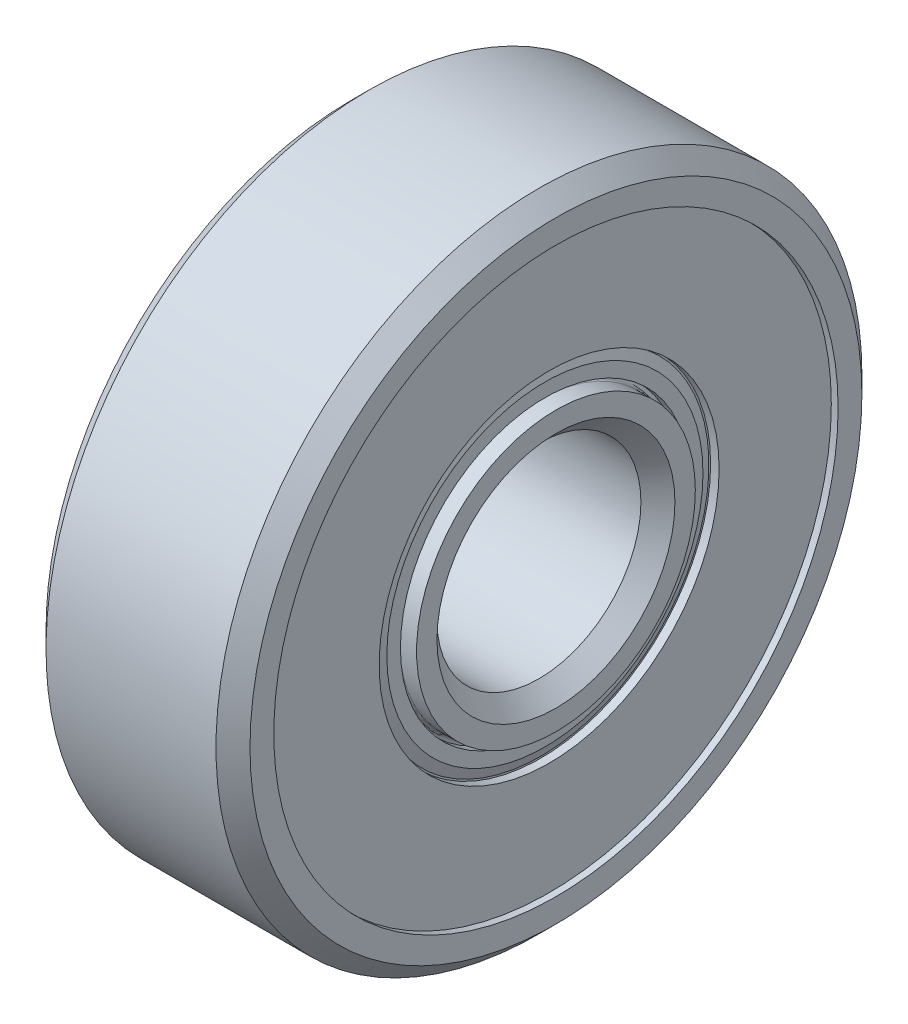
ISO-10303-21;
HEADER;
FILE_DESCRIPTION(('STEP AP214'),'2;1');
FILE_NAME('part.step','',(''),(''),'','','');
FILE_SCHEMA(('AUTOMOTIVE_DESIGN { 1 0 10303 214 1 1 1 1 }'));
ENDSEC;
DATA;
#1=APPLICATION_CONTEXT('core data for automotive mechanical design processes');
#2=APPLICATION_PROTOCOL_DEFINITION('international standard','automotive_design',2000,#1);
#3=PRODUCT_CONTEXT('',#1,'mechanical');
#4=PRODUCT('Part','Part','',(#3));
#5=PRODUCT_RELATED_PRODUCT_CATEGORY('part','',(#4));
#6=PRODUCT_DEFINITION_FORMATION('','',#4);
#7=PRODUCT_DEFINITION_CONTEXT('part definition',#1,'design');
#8=PRODUCT_DEFINITION('design','',#6,#7);
#9=PRODUCT_DEFINITION_SHAPE('','',#8);
#10=(LENGTH_UNIT() NAMED_UNIT(*) SI_UNIT(.MILLI.,.METRE.));
#11=(NAMED_UNIT(*) PLANE_ANGLE_UNIT() SI_UNIT($,.RADIAN.));
#12=(NAMED_UNIT(*) SI_UNIT($,.STERADIAN.) SOLID_ANGLE_UNIT());
#13=UNCERTAINTY_MEASURE_WITH_UNIT(LENGTH_MEASURE(1.E-05),#10,'distance_accuracy_value','');
#14=(GEOMETRIC_REPRESENTATION_CONTEXT(3) GLOBAL_UNCERTAINTY_ASSIGNED_CONTEXT((#13)) GLOBAL_UNIT_ASSIGNED_CONTEXT((#10,
#11,#12)) REPRESENTATION_CONTEXT('',''));
#15=CARTESIAN_POINT('',(0.,0.,0.));
#16=DIRECTION('',(0.,0.,1.));
#17=DIRECTION('',(1.,0.,0.));
#18=AXIS2_PLACEMENT_3D('',#15,#16,#17);
#19=CARTESIAN_POINT('',(0.,0.,0.));
#20=DIRECTION('',(1.,0.,0.));
#21=DIRECTION('',(0.,0.,-1.));
#22=AXIS2_PLACEMENT_3D('',#19,#20,#21);
#23=CYLINDRICAL_SURFACE('',#22,8.3);
#24=CARTESIAN_POINT('',(2.8,0.,0.));
#25=DIRECTION('',(1.,0.,0.));
#26=DIRECTION('',(0.,0.,-1.));
#27=AXIS2_PLACEMENT_3D('',#24,#25,#26);
#28=CIRCLE('',#27,8.3);
#29=CARTESIAN_POINT('',(2.8,0.,-8.3));
#30=VERTEX_POINT('',#29);
#31=EDGE_CURVE('P0_E10',#30,#30,#28,.T.);
#32=ORIENTED_EDGE('',*,*,#31,.F.);
#33=EDGE_LOOP('',(#32));
#34=FACE_BOUND('',#33,.T.);
#35=CARTESIAN_POINT('',(2.99999999999998,0.,0.));
#36=DIRECTION('',(1.,0.,0.));
#37=DIRECTION('',(0.,0.,-1.));
#38=AXIS2_PLACEMENT_3D('',#35,#36,#37);
#39=CIRCLE('',#38,8.3);
#40=CARTESIAN_POINT('',(2.99999999999998,0.,-8.3));
#41=VERTEX_POINT('',#40);
#42=EDGE_CURVE('P0_E38',#41,#41,#39,.T.);
#43=ORIENTED_EDGE('',*,*,#42,.T.);
#44=EDGE_LOOP('',(#43));
#45=FACE_BOUND('',#44,.T.);
#46=ADVANCED_FACE('P0_F15',(#34,#45),#23,.F.);
#47=CARTESIAN_POINT('',(0.,0.,0.));
#48=DIRECTION('',(1.,0.,0.));
#49=DIRECTION('',(0.,0.,-1.));
#50=AXIS2_PLACEMENT_3D('',#47,#48,#49);
#51=CYLINDRICAL_SURFACE('',#50,8.5);
#52=CARTESIAN_POINT('',(2.3,0.,0.));
#53=DIRECTION('',(1.,0.,0.));
#54=DIRECTION('',(0.,0.,-1.));
#55=AXIS2_PLACEMENT_3D('',#52,#53,#54);
#56=CIRCLE('',#55,8.5);
#57=CARTESIAN_POINT('',(2.3,0.,-8.5));
#58=VERTEX_POINT('',#57);
#59=EDGE_CURVE('P0_E24',#58,#58,#56,.T.);
#60=ORIENTED_EDGE('',*,*,#59,.F.);
#61=EDGE_LOOP('',(#60));
#62=FACE_BOUND('',#61,.T.);
#63=CARTESIAN_POINT('',(2.8,0.,0.));
#64=DIRECTION('',(1.,0.,0.));
#65=DIRECTION('',(0.,0.,-1.));
#66=AXIS2_PLACEMENT_3D('',#63,#64,#65);
#67=CIRCLE('',#66,8.5);
#68=CARTESIAN_POINT('',(2.8,0.,-8.5));
#69=VERTEX_POINT('',#68);
#70=EDGE_CURVE('P0_E39',#69,#69,#67,.T.);
#71=ORIENTED_EDGE('',*,*,#70,.T.);
#72=EDGE_LOOP('',(#71));
#73=FACE_BOUND('',#72,.T.);
#74=ADVANCED_FACE('P0_F111',(#62,#73),#51,.F.);
#75=CARTESIAN_POINT('',(0.,0.,0.));
#76=DIRECTION('',(1.,0.,0.));
#77=DIRECTION('',(0.,0.,-1.));
#78=AXIS2_PLACEMENT_3D('',#75,#76,#77);
#79=CYLINDRICAL_SURFACE('',#78,8.);
#80=CARTESIAN_POINT('',(1.3228756555323,0.,0.));
#81=DIRECTION('',(1.,0.,0.));
#82=DIRECTION('',(0.,0.,-1.));
#83=AXIS2_PLACEMENT_3D('',#80,#81,#82);
#84=CIRCLE('',#83,8.);
#85=CARTESIAN_POINT('',(1.3228756555323,0.,-8.));
#86=VERTEX_POINT('',#85);
#87=EDGE_CURVE('P0_E34',#86,#86,#84,.T.);
#88=ORIENTED_EDGE('',*,*,#87,.F.);
#89=EDGE_LOOP('',(#88));
#90=FACE_BOUND('',#89,.T.);
#91=CARTESIAN_POINT('',(2.3,0.,0.));
#92=DIRECTION('',(1.,0.,0.));
#93=DIRECTION('',(0.,0.,-1.));
#94=AXIS2_PLACEMENT_3D('',#91,#92,#93);
#95=CIRCLE('',#94,8.);
#96=CARTESIAN_POINT('',(2.3,0.,-8.));
#97=VERTEX_POINT('',#96);
#98=EDGE_CURVE('P0_E42',#97,#97,#95,.T.);
#99=ORIENTED_EDGE('',*,*,#98,.T.);
#100=EDGE_LOOP('',(#99));
#101=FACE_BOUND('',#100,.T.);
#102=ADVANCED_FACE('P0_F117',(#90,#101),#79,.F.);
#103=CARTESIAN_POINT('',(0.,0.,0.));
#104=DIRECTION('',(1.,0.,0.));
#105=DIRECTION('',(0.,-0.479425538604203,0.877582561890373));
#106=AXIS2_PLACEMENT_3D('',#103,#104,#105);
#107=TOROIDAL_SURFACE('',#106,6.5,2.);
#108=CARTESIAN_POINT('',(-1.32287565553229,0.,0.));
#109=DIRECTION('',(1.,0.,0.));
#110=DIRECTION('',(0.,0.,-1.));
#111=AXIS2_PLACEMENT_3D('',#108,#109,#110);
#112=CIRCLE('',#111,8.);
#113=CARTESIAN_POINT('',(-1.32287565553229,0.,-8.));
#114=VERTEX_POINT('',#113);
#115=EDGE_CURVE('P0_E51',#114,#114,#112,.T.);
#116=ORIENTED_EDGE('',*,*,#115,.F.);
#117=EDGE_LOOP('',(#116));
#118=FACE_BOUND('',#117,.T.);
#119=ORIENTED_EDGE('',*,*,#87,.T.);
#120=EDGE_LOOP('',(#119));
#121=FACE_BOUND('',#120,.T.);
#122=ADVANCED_FACE('P0_F123',(#118,#121),#107,.F.);
#123=CARTESIAN_POINT('',(0.,0.,0.));
#124=DIRECTION('',(1.,0.,0.));
#125=DIRECTION('',(0.,0.,-1.));
#126=AXIS2_PLACEMENT_3D('',#123,#124,#125);
#127=CYLINDRICAL_SURFACE('',#126,8.);
#128=CARTESIAN_POINT('',(-2.3,0.,0.));
#129=DIRECTION('',(1.,0.,0.));
#130=DIRECTION('',(0.,0.,-1.));
#131=AXIS2_PLACEMENT_3D('',#128,#129,#130);
#132=CIRCLE('',#131,8.);
#133=CARTESIAN_POINT('',(-2.3,0.,-8.));
#134=VERTEX_POINT('',#133);
#135=EDGE_CURVE('P0_E55',#134,#134,#132,.T.);
#136=ORIENTED_EDGE('',*,*,#135,.F.);
#137=EDGE_LOOP('',(#136));
#138=FACE_BOUND('',#137,.T.);
#139=ORIENTED_EDGE('',*,*,#115,.T.);
#140=EDGE_LOOP('',(#139));
#141=FACE_BOUND('',#140,.T.);
#142=ADVANCED_FACE('P0_F127',(#138,#141),#127,.F.);
#143=CARTESIAN_POINT('',(0.,0.,0.));
#144=DIRECTION('',(1.,0.,0.));
#145=DIRECTION('',(0.,0.,-1.));
#146=AXIS2_PLACEMENT_3D('',#143,#144,#145);
#147=CYLINDRICAL_SURFACE('',#146,8.5);
#148=CARTESIAN_POINT('',(-2.8,0.,0.));
#149=DIRECTION('',(1.,0.,0.));
#150=DIRECTION('',(0.,0.,-1.));
#151=AXIS2_PLACEMENT_3D('',#148,#149,#150);
#152=CIRCLE('',#151,8.5);
#153=CARTESIAN_POINT('',(-2.8,0.,-8.5));
#154=VERTEX_POINT('',#153);
#155=EDGE_CURVE('P0_E59',#154,#154,#152,.T.);
#156=ORIENTED_EDGE('',*,*,#155,.F.);
#157=EDGE_LOOP('',(#156));
#158=FACE_BOUND('',#157,.T.);
#159=CARTESIAN_POINT('',(-2.3,0.,0.));
#160=DIRECTION('',(1.,0.,0.));
#161=DIRECTION('',(0.,0.,-1.));
#162=AXIS2_PLACEMENT_3D('',#159,#160,#161);
#163=CIRCLE('',#162,8.5);
#164=CARTESIAN_POINT('',(-2.3,0.,-8.5));
#165=VERTEX_POINT('',#164);
#166=EDGE_CURVE('P0_E47',#165,#165,#163,.T.);
#167=ORIENTED_EDGE('',*,*,#166,.T.);
#168=EDGE_LOOP('',(#167));
#169=FACE_BOUND('',#168,.T.);
#170=ADVANCED_FACE('P0_F131',(#158,#169),#147,.F.);
#171=CARTESIAN_POINT('',(0.,0.,0.));
#172=DIRECTION('',(1.,0.,0.));
#173=DIRECTION('',(0.,0.,-1.));
#174=AXIS2_PLACEMENT_3D('',#171,#172,#173);
#175=CYLINDRICAL_SURFACE('',#174,8.3);
#176=CARTESIAN_POINT('',(-3.00000000000003,0.,0.));
#177=DIRECTION('',(1.,0.,0.));
#178=DIRECTION('',(0.,0.,-1.));
#179=AXIS2_PLACEMENT_3D('',#176,#177,#178);
#180=CIRCLE('',#179,8.3);
#181=CARTESIAN_POINT('',(-3.00000000000003,0.,-8.3));
#182=VERTEX_POINT('',#181);
#183=EDGE_CURVE('P0_E41',#182,#182,#180,.T.);
#184=ORIENTED_EDGE('',*,*,#183,.F.);
#185=EDGE_LOOP('',(#184));
#186=FACE_BOUND('',#185,.T.);
#187=CARTESIAN_POINT('',(-2.8,0.,0.));
#188=DIRECTION('',(1.,0.,0.));
#189=DIRECTION('',(0.,0.,-1.));
#190=AXIS2_PLACEMENT_3D('',#187,#188,#189);
#191=CIRCLE('',#190,8.3);
#192=CARTESIAN_POINT('',(-2.8,0.,-8.3));
#193=VERTEX_POINT('',#192);
#194=EDGE_CURVE('P0_E63',#193,#193,#191,.T.);
#195=ORIENTED_EDGE('',*,*,#194,.T.);
#196=EDGE_LOOP('',(#195));
#197=FACE_BOUND('',#196,.T.);
#198=ADVANCED_FACE('P0_F135',(#186,#197),#175,.F.);
#199=CARTESIAN_POINT('',(2.8,0.,8.3));
#200=DIRECTION('',(1.,0.,0.));
#201=DIRECTION('',(0.,0.,-1.));
#202=AXIS2_PLACEMENT_3D('',#199,#200,#201);
#203=PLANE('',#202);
#204=ORIENTED_EDGE('',*,*,#70,.F.);
#205=EDGE_LOOP('',(#204));
#206=FACE_BOUND('',#205,.T.);
#207=ORIENTED_EDGE('',*,*,#31,.T.);
#208=EDGE_LOOP('',(#207));
#209=FACE_BOUND('',#208,.T.);
#210=ADVANCED_FACE('P0_F139',(#206,#209),#203,.F.);
#211=CARTESIAN_POINT('',(2.30000000000001,0.,8.5));
#212=DIRECTION('',(1.,0.,0.));
#213=DIRECTION('',(0.,0.,-1.));
#214=AXIS2_PLACEMENT_3D('',#211,#212,#213);
#215=PLANE('',#214);
#216=ORIENTED_EDGE('',*,*,#59,.T.);
#217=EDGE_LOOP('',(#216));
#218=FACE_BOUND('',#217,.T.);
#219=ORIENTED_EDGE('',*,*,#98,.F.);
#220=EDGE_LOOP('',(#219));
#221=FACE_BOUND('',#220,.T.);
#222=ADVANCED_FACE('P0_F143',(#218,#221),#215,.T.);
#223=CARTESIAN_POINT('',(-2.3,0.,8.5));
#224=DIRECTION('',(1.,0.,0.));
#225=DIRECTION('',(0.,0.,-1.));
#226=AXIS2_PLACEMENT_3D('',#223,#224,#225);
#227=PLANE('',#226);
#228=ORIENTED_EDGE('',*,*,#166,.F.);
#229=EDGE_LOOP('',(#228));
#230=FACE_BOUND('',#229,.T.);
#231=ORIENTED_EDGE('',*,*,#135,.T.);
#232=EDGE_LOOP('',(#231));
#233=FACE_BOUND('',#232,.T.);
#234=ADVANCED_FACE('P0_F147',(#230,#233),#227,.F.);
#235=CARTESIAN_POINT('',(-2.8,0.,8.3));
#236=DIRECTION('',(1.,0.,0.));
#237=DIRECTION('',(0.,0.,-1.));
#238=AXIS2_PLACEMENT_3D('',#235,#236,#237);
#239=PLANE('',#238);
#240=ORIENTED_EDGE('',*,*,#155,.T.);
#241=EDGE_LOOP('',(#240));
#242=FACE_BOUND('',#241,.T.);
#243=ORIENTED_EDGE('',*,*,#194,.F.);
#244=EDGE_LOOP('',(#243));
#245=FACE_BOUND('',#244,.T.);
#246=ADVANCED_FACE('P0_F151',(#242,#245),#239,.T.);
#247=CARTESIAN_POINT('',(-3.,0.,9.50000095367423));
#248=DIRECTION('',(1.,0.,0.));
#249=DIRECTION('',(0.,0.,-1.));
#250=AXIS2_PLACEMENT_3D('',#247,#248,#249);
#251=PLANE('',#250);
#252=CARTESIAN_POINT('',(-3.,0.,0.));
#253=DIRECTION('',(1.,0.,0.));
#254=DIRECTION('',(0.,0.,-1.));
#255=AXIS2_PLACEMENT_3D('',#252,#253,#254);
#256=CIRCLE('',#255,9.);
#257=CARTESIAN_POINT('',(-3.,0.,-9.00000000000001));
#258=VERTEX_POINT('',#257);
#259=EDGE_CURVE('P0_E70',#258,#258,#256,.T.);
#260=ORIENTED_EDGE('',*,*,#259,.F.);
#261=EDGE_LOOP('',(#260));
#262=FACE_BOUND('',#261,.T.);
#263=ORIENTED_EDGE('',*,*,#183,.T.);
#264=EDGE_LOOP('',(#263));
#265=FACE_BOUND('',#264,.T.);
#266=ADVANCED_FACE('P0_F107',(#262,#265),#251,.F.);
#267=CARTESIAN_POINT('',(-12.,0.,0.));
#268=DIRECTION('',(1.,0.,0.));
#269=DIRECTION('',(0.,1.,0.));
#270=AXIS2_PLACEMENT_3D('',#267,#268,#269);
#271=CONICAL_SURFACE('',#270,0.,0.785398163397451);
#272=ORIENTED_EDGE('',*,*,#259,.T.);
#273=EDGE_LOOP('',(#272));
#274=FACE_BOUND('',#273,.T.);
#275=CARTESIAN_POINT('',(-2.50000000000001,0.,0.));
#276=DIRECTION('',(1.,0.,0.));
#277=DIRECTION('',(0.,1.,0.));
#278=AXIS2_PLACEMENT_3D('',#275,#276,#277);
#279=CIRCLE('',#278,9.5);
#280=CARTESIAN_POINT('',(-2.49999999999998,9.5,0.));
#281=VERTEX_POINT('',#280);
#282=EDGE_CURVE('P0_E77',#281,#281,#279,.T.);
#283=ORIENTED_EDGE('',*,*,#282,.F.);
#284=EDGE_LOOP('',(#283));
#285=FACE_BOUND('',#284,.T.);
#286=ADVANCED_FACE('P0_F99',(#274,#285),#271,.T.);
#287=CARTESIAN_POINT('',(3.,0.,8.3));
#288=DIRECTION('',(1.,0.,0.));
#289=DIRECTION('',(0.,0.,-1.));
#290=AXIS2_PLACEMENT_3D('',#287,#288,#289);
#291=PLANE('',#290);
#292=CARTESIAN_POINT('',(3.,0.,0.));
#293=DIRECTION('',(1.,0.,0.));
#294=DIRECTION('',(0.,0.,-1.));
#295=AXIS2_PLACEMENT_3D('',#292,#293,#294);
#296=CIRCLE('',#295,9.);
#297=CARTESIAN_POINT('',(3.,0.,-9.));
#298=VERTEX_POINT('',#297);
#299=EDGE_CURVE('P0_E80',#298,#298,#296,.T.);
#300=ORIENTED_EDGE('',*,*,#299,.T.);
#301=EDGE_LOOP('',(#300));
#302=FACE_BOUND('',#301,.T.);
#303=ORIENTED_EDGE('',*,*,#42,.F.);
#304=EDGE_LOOP('',(#303));
#305=FACE_BOUND('',#304,.T.);
#306=ADVANCED_FACE('P0_F96',(#302,#305),#291,.T.);
#307=CARTESIAN_POINT('',(0.,0.,0.));
#308=DIRECTION('',(1.,0.,0.));
#309=DIRECTION('',(0.,0.,-1.));
#310=AXIS2_PLACEMENT_3D('',#307,#308,#309);
#311=CYLINDRICAL_SURFACE('',#310,9.5);
#312=CARTESIAN_POINT('',(2.5,0.,0.));
#313=DIRECTION('',(1.,0.,0.));
#314=DIRECTION('',(0.,0.,-1.));
#315=AXIS2_PLACEMENT_3D('',#312,#313,#314);
#316=CIRCLE('',#315,9.5);
#317=CARTESIAN_POINT('',(2.5,0.,-9.5));
#318=VERTEX_POINT('',#317);
#319=EDGE_CURVE('P0_E19',#318,#318,#316,.T.);
#320=ORIENTED_EDGE('',*,*,#319,.F.);
#321=EDGE_LOOP('',(#320));
#322=FACE_BOUND('',#321,.T.);
#323=ORIENTED_EDGE('',*,*,#282,.T.);
#324=EDGE_LOOP('',(#323));
#325=FACE_BOUND('',#324,.T.);
#326=ADVANCED_FACE('P0_F98',(#322,#325),#311,.T.);
#327=CARTESIAN_POINT('',(12.,0.,0.));
#328=DIRECTION('',(-1.,0.,0.));
#329=DIRECTION('',(0.,-1.,0.));
#330=AXIS2_PLACEMENT_3D('',#327,#328,#329);
#331=CONICAL_SURFACE('',#330,0.,0.785398163397447);
#332=ORIENTED_EDGE('',*,*,#319,.T.);
#333=EDGE_LOOP('',(#332));
#334=FACE_BOUND('',#333,.T.);
#335=ORIENTED_EDGE('',*,*,#299,.F.);
#336=EDGE_LOOP('',(#335));
#337=FACE_BOUND('',#336,.T.);
#338=ADVANCED_FACE('P0_F17',(#334,#337),#331,.T.);
#339=CLOSED_SHELL('',(#46,#74,#102,#122,#142,#170,#198,#210,#222,#234,#246,#266,#286,#306,#326,#338));
#340=MANIFOLD_SOLID_BREP('P0_B1',#339);
#341=CARTESIAN_POINT('',(0.,0.,0.));
#342=DIRECTION('',(1.,0.,0.));
#343=DIRECTION('',(0.,0.,-1.));
#344=AXIS2_PLACEMENT_3D('',#341,#342,#343);
#345=CYLINDRICAL_SURFACE('',#344,4.7);
#346=CARTESIAN_POINT('',(-0.871779788708135,0.,0.));
#347=DIRECTION('',(1.,0.,0.));
#348=DIRECTION('',(0.,0.,-1.));
#349=AXIS2_PLACEMENT_3D('',#346,#347,#348);
#350=CIRCLE('',#349,4.7);
#351=CARTESIAN_POINT('',(-0.871779788708135,0.,-4.7));
#352=VERTEX_POINT('',#351);
#353=EDGE_CURVE('P1_E10',#352,#352,#350,.T.);
#354=ORIENTED_EDGE('',*,*,#353,.F.);
#355=EDGE_LOOP('',(#354));
#356=FACE_BOUND('',#355,.T.);
#357=CARTESIAN_POINT('',(-2.30000000000008,0.,0.));
#358=DIRECTION('',(1.,0.,0.));
#359=DIRECTION('',(0.,0.,-1.));
#360=AXIS2_PLACEMENT_3D('',#357,#358,#359);
#361=CIRCLE('',#360,4.7);
#362=CARTESIAN_POINT('',(-2.30000000000008,0.,-4.7));
#363=VERTEX_POINT('',#362);
#364=EDGE_CURVE('P1_E36',#363,#363,#361,.T.);
#365=ORIENTED_EDGE('',*,*,#364,.T.);
#366=EDGE_LOOP('',(#365));
#367=FACE_BOUND('',#366,.T.);
#368=ADVANCED_FACE('P1_F15',(#356,#367),#345,.T.);
#369=CARTESIAN_POINT('',(0.,0.,0.));
#370=DIRECTION('',(1.,0.,0.));
#371=DIRECTION('',(0.,-0.479425538604203,0.877582561890373));
#372=AXIS2_PLACEMENT_3D('',#369,#370,#371);
#373=TOROIDAL_SURFACE('',#372,6.5,2.);
#374=CARTESIAN_POINT('',(0.871779788708136,0.,0.));
#375=DIRECTION('',(1.,0.,0.));
#376=DIRECTION('',(0.,0.,-1.));
#377=AXIS2_PLACEMENT_3D('',#374,#375,#376);
#378=CIRCLE('',#377,4.7);
#379=CARTESIAN_POINT('',(0.871779788708136,0.,-4.7));
#380=VERTEX_POINT('',#379);
#381=EDGE_CURVE('P1_E24',#380,#380,#378,.T.);
#382=ORIENTED_EDGE('',*,*,#381,.F.);
#383=EDGE_LOOP('',(#382));
#384=FACE_BOUND('',#383,.T.);
#385=ORIENTED_EDGE('',*,*,#353,.T.);
#386=EDGE_LOOP('',(#385));
#387=FACE_BOUND('',#386,.T.);
#388=ADVANCED_FACE('P1_F107',(#384,#387),#373,.F.);
#389=CARTESIAN_POINT('',(0.,0.,0.));
#390=DIRECTION('',(1.,0.,0.));
#391=DIRECTION('',(0.,0.,-1.));
#392=AXIS2_PLACEMENT_3D('',#389,#390,#391);
#393=CYLINDRICAL_SURFACE('',#392,4.7);
#394=CARTESIAN_POINT('',(2.3,0.,0.));
#395=DIRECTION('',(1.,0.,0.));
#396=DIRECTION('',(0.,0.,-1.));
#397=AXIS2_PLACEMENT_3D('',#394,#395,#396);
#398=CIRCLE('',#397,4.7);
#399=CARTESIAN_POINT('',(2.3,0.,-4.7));
#400=VERTEX_POINT('',#399);
#401=EDGE_CURVE('P1_E33',#400,#400,#398,.T.);
#402=ORIENTED_EDGE('',*,*,#401,.F.);
#403=EDGE_LOOP('',(#402));
#404=FACE_BOUND('',#403,.T.);
#405=ORIENTED_EDGE('',*,*,#381,.T.);
#406=EDGE_LOOP('',(#405));
#407=FACE_BOUND('',#406,.T.);
#408=ADVANCED_FACE('P1_F113',(#404,#407),#393,.T.);
#409=CARTESIAN_POINT('',(0.,0.,0.));
#410=DIRECTION('',(1.,0.,0.));
#411=DIRECTION('',(0.,0.,-1.));
#412=AXIS2_PLACEMENT_3D('',#409,#410,#411);
#413=CYLINDRICAL_SURFACE('',#412,4.1);
#414=CARTESIAN_POINT('',(-2.5,0.,0.));
#415=DIRECTION('',(-1.,0.,0.));
#416=DIRECTION('',(0.,0.,-1.));
#417=AXIS2_PLACEMENT_3D('',#414,#415,#416);
#418=CIRCLE('',#417,4.1);
#419=CARTESIAN_POINT('',(-2.5,0.,-4.1));
#420=VERTEX_POINT('',#419);
#421=EDGE_CURVE('P1_E41',#420,#420,#418,.T.);
#422=ORIENTED_EDGE('',*,*,#421,.T.);
#423=EDGE_LOOP('',(#422));
#424=FACE_BOUND('',#423,.T.);
#425=CARTESIAN_POINT('',(-3.,0.,0.));
#426=DIRECTION('',(1.,0.,0.));
#427=DIRECTION('',(0.,0.,-1.));
#428=AXIS2_PLACEMENT_3D('',#425,#426,#427);
#429=CIRCLE('',#428,4.1);
#430=CARTESIAN_POINT('',(-3.,0.,-4.1));
#431=VERTEX_POINT('',#430);
#432=EDGE_CURVE('P1_E47',#431,#431,#429,.T.);
#433=ORIENTED_EDGE('',*,*,#432,.T.);
#434=EDGE_LOOP('',(#433));
#435=FACE_BOUND('',#434,.T.);
#436=ADVANCED_FACE('P1_F120',(#424,#435),#413,.T.);
#437=CARTESIAN_POINT('',(-2.3,0.,4.1));
#438=DIRECTION('',(1.,0.,0.));
#439=DIRECTION('',(0.,0.,-1.));
#440=AXIS2_PLACEMENT_3D('',#437,#438,#439);
#441=PLANE('',#440);
#442=ORIENTED_EDGE('',*,*,#364,.F.);
#443=EDGE_LOOP('',(#442));
#444=FACE_BOUND('',#443,.T.);
#445=CARTESIAN_POINT('',(-2.3,-1.03028696685215E-13,0.));
#446=DIRECTION('',(-1.,0.,0.));
#447=DIRECTION('',(0.,0.,-1.));
#448=AXIS2_PLACEMENT_3D('',#445,#446,#447);
#449=CIRCLE('',#448,4.3000000000001);
#450=CARTESIAN_POINT('',(-2.3,-1.03028696685215E-13,-4.30000000000016));
#451=VERTEX_POINT('',#450);
#452=EDGE_CURVE('P1_E45',#451,#451,#449,.T.);
#453=ORIENTED_EDGE('',*,*,#452,.F.);
#454=EDGE_LOOP('',(#453));
#455=FACE_BOUND('',#454,.T.);
#456=ADVANCED_FACE('P1_F124',(#444,#455),#441,.F.);
#457=CARTESIAN_POINT('',(-2.5,0.,0.));
#458=DIRECTION('',(1.,0.,0.));
#459=DIRECTION('',(0.,0.410310314294082,-0.91194596659226));
#460=AXIS2_PLACEMENT_3D('',#457,#458,#459);
#461=TOROIDAL_SURFACE('',#460,4.3,0.2);
#462=ORIENTED_EDGE('',*,*,#421,.F.);
#463=EDGE_LOOP('',(#462));
#464=FACE_BOUND('',#463,.T.);
#465=ORIENTED_EDGE('',*,*,#452,.T.);
#466=EDGE_LOOP('',(#465));
#467=FACE_BOUND('',#466,.T.);
#468=ADVANCED_FACE('P1_F128',(#464,#467),#461,.F.);
#469=CARTESIAN_POINT('',(0.,0.,0.));
#470=DIRECTION('',(1.,0.,0.));
#471=DIRECTION('',(0.,0.,-1.));
#472=AXIS2_PLACEMENT_3D('',#469,#470,#471);
#473=CYLINDRICAL_SURFACE('',#472,4.1);
#474=CARTESIAN_POINT('',(3.,0.,0.));
#475=DIRECTION('',(1.,0.,0.));
#476=DIRECTION('',(0.,0.,-1.));
#477=AXIS2_PLACEMENT_3D('',#474,#475,#476);
#478=CIRCLE('',#477,4.1);
#479=CARTESIAN_POINT('',(3.,0.,-4.1));
#480=VERTEX_POINT('',#479);
#481=EDGE_CURVE('P1_E58',#480,#480,#478,.T.);
#482=ORIENTED_EDGE('',*,*,#481,.F.);
#483=EDGE_LOOP('',(#482));
#484=FACE_BOUND('',#483,.T.);
#485=CARTESIAN_POINT('',(2.5,0.,0.));
#486=DIRECTION('',(-1.,0.,0.));
#487=DIRECTION('',(0.,0.,-1.));
#488=AXIS2_PLACEMENT_3D('',#485,#486,#487);
#489=CIRCLE('',#488,4.1);
#490=CARTESIAN_POINT('',(2.5,0.,-4.1));
#491=VERTEX_POINT('',#490);
#492=EDGE_CURVE('P1_E46',#491,#491,#489,.T.);
#493=ORIENTED_EDGE('',*,*,#492,.F.);
#494=EDGE_LOOP('',(#493));
#495=FACE_BOUND('',#494,.T.);
#496=ADVANCED_FACE('P1_F132',(#484,#495),#473,.T.);
#497=CARTESIAN_POINT('',(2.3,0.,4.1));
#498=DIRECTION('',(1.,0.,0.));
#499=DIRECTION('',(0.,0.,-1.));
#500=AXIS2_PLACEMENT_3D('',#497,#498,#499);
#501=PLANE('',#500);
#502=ORIENTED_EDGE('',*,*,#401,.T.);
#503=EDGE_LOOP('',(#502));
#504=FACE_BOUND('',#503,.T.);
#505=CARTESIAN_POINT('',(2.3,0.,-2.1582735598713E-13));
#506=DIRECTION('',(-1.,0.,0.));
#507=DIRECTION('',(0.,0.,-1.));
#508=AXIS2_PLACEMENT_3D('',#505,#506,#507);
#509=CIRCLE('',#508,4.30000000000017);
#510=CARTESIAN_POINT('',(2.3,0.,-4.30000000000038));
#511=VERTEX_POINT('',#510);
#512=EDGE_CURVE('P1_E62',#511,#511,#509,.T.);
#513=ORIENTED_EDGE('',*,*,#512,.T.);
#514=EDGE_LOOP('',(#513));
#515=FACE_BOUND('',#514,.T.);
#516=ADVANCED_FACE('P1_F136',(#504,#515),#501,.T.);
#517=CARTESIAN_POINT('',(2.5,0.,-1.91180404840452E-13));
#518=DIRECTION('',(1.,0.,0.));
#519=DIRECTION('',(0.,0.195862937339204,-0.980631281255528));
#520=AXIS2_PLACEMENT_3D('',#517,#518,#519);
#521=TOROIDAL_SURFACE('',#520,4.30000000000018,0.2);
#522=ORIENTED_EDGE('',*,*,#512,.F.);
#523=EDGE_LOOP('',(#522));
#524=FACE_BOUND('',#523,.T.);
#525=ORIENTED_EDGE('',*,*,#492,.T.);
#526=EDGE_LOOP('',(#525));
#527=FACE_BOUND('',#526,.T.);
#528=ADVANCED_FACE('P1_F103',(#524,#527),#521,.F.);
#529=CARTESIAN_POINT('',(3.,0.,3.));
#530=DIRECTION('',(1.,0.,0.));
#531=DIRECTION('',(0.,0.,-1.));
#532=AXIS2_PLACEMENT_3D('',#529,#530,#531);
#533=PLANE('',#532);
#534=ORIENTED_EDGE('',*,*,#481,.T.);
#535=EDGE_LOOP('',(#534));
#536=FACE_BOUND('',#535,.T.);
#537=CARTESIAN_POINT('',(3.,0.,-6.20836715370388E-13));
#538=DIRECTION('',(1.,0.,0.));
#539=DIRECTION('',(0.,0.,-1.));
#540=AXIS2_PLACEMENT_3D('',#537,#538,#539);
#541=CIRCLE('',#540,3.50000000000062);
#542=CARTESIAN_POINT('',(3.,0.,-3.50000000000124));
#543=VERTEX_POINT('',#542);
#544=EDGE_CURVE('P1_E66',#543,#543,#541,.T.);
#545=ORIENTED_EDGE('',*,*,#544,.F.);
#546=EDGE_LOOP('',(#545));
#547=FACE_BOUND('',#546,.T.);
#548=ADVANCED_FACE('P1_F93',(#536,#547),#533,.T.);
#549=CARTESIAN_POINT('',(-0.499999999995958,-1.83408843667828E-13,3.87601062356612E-12));
#550=DIRECTION('',(1.,0.,-1.29185551145383E-12));
#551=DIRECTION('',(-1.29185551145383E-12,0.,-1.));
#552=AXIS2_PLACEMENT_3D('',#549,#550,#551);
#553=CONICAL_SURFACE('',#552,0.,0.785398163397587);
#554=ORIENTED_EDGE('',*,*,#544,.T.);
#555=EDGE_LOOP('',(#554));
#556=FACE_BOUND('',#555,.T.);
#557=CARTESIAN_POINT('',(2.50000000000343,0.,0.));
#558=DIRECTION('',(1.,-4.01224762703479E-13,-1.64624761460464E-13));
#559=DIRECTION('',(4.01224762703479E-13,1.,0.));
#560=AXIS2_PLACEMENT_3D('',#557,#558,#559);
#561=CIRCLE('',#560,3.00000000000022);
#562=CARTESIAN_POINT('',(2.50000000000463,3.00000000000022,0.));
#563=VERTEX_POINT('',#562);
#564=EDGE_CURVE('P1_E51',#563,#563,#561,.T.);
#565=ORIENTED_EDGE('',*,*,#564,.F.);
#566=EDGE_LOOP('',(#565));
#567=FACE_BOUND('',#566,.T.);
#568=ADVANCED_FACE('P1_F91',(#556,#567),#553,.F.);
#569=CARTESIAN_POINT('',(-3.,0.,3.));
#570=DIRECTION('',(1.,0.,0.));
#571=DIRECTION('',(0.,0.,-1.));
#572=AXIS2_PLACEMENT_3D('',#569,#570,#571);
#573=PLANE('',#572);
#574=ORIENTED_EDGE('',*,*,#432,.F.);
#575=EDGE_LOOP('',(#574));
#576=FACE_BOUND('',#575,.T.);
#577=CARTESIAN_POINT('',(-3.,0.,0.));
#578=DIRECTION('',(1.,0.,0.));
#579=DIRECTION('',(0.,0.,-1.));
#580=AXIS2_PLACEMENT_3D('',#577,#578,#579);
#581=CIRCLE('',#580,3.50000000000019);
#582=CARTESIAN_POINT('',(-3.,0.,-3.50000000000018));
#583=VERTEX_POINT('',#582);
#584=EDGE_CURVE('P1_E72',#583,#583,#581,.T.);
#585=ORIENTED_EDGE('',*,*,#584,.T.);
#586=EDGE_LOOP('',(#585));
#587=FACE_BOUND('',#586,.T.);
#588=ADVANCED_FACE('P1_F88',(#576,#587),#573,.F.);
#589=CARTESIAN_POINT('',(0.,0.,0.));
#590=DIRECTION('',(1.,0.,0.));
#591=DIRECTION('',(0.,0.,-1.));
#592=AXIS2_PLACEMENT_3D('',#589,#590,#591);
#593=CYLINDRICAL_SURFACE('',#592,3.);
#594=CARTESIAN_POINT('',(-2.5,0.,0.));
#595=DIRECTION('',(1.,0.,0.));
#596=DIRECTION('',(0.,0.,-1.));
#597=AXIS2_PLACEMENT_3D('',#594,#595,#596);
#598=CIRCLE('',#597,3.);
#599=CARTESIAN_POINT('',(-2.5,0.,-3.));
#600=VERTEX_POINT('',#599);
#601=EDGE_CURVE('P1_E19',#600,#600,#598,.T.);
#602=ORIENTED_EDGE('',*,*,#601,.F.);
#603=EDGE_LOOP('',(#602));
#604=FACE_BOUND('',#603,.T.);
#605=ORIENTED_EDGE('',*,*,#564,.T.);
#606=EDGE_LOOP('',(#605));
#607=FACE_BOUND('',#606,.T.);
#608=ADVANCED_FACE('P1_F85',(#604,#607),#593,.F.);
#609=CARTESIAN_POINT('',(0.499999999999195,-8.47322212393692E-13,0.));
#610=DIRECTION('',(-1.,2.8244073746464E-13,0.));
#611=DIRECTION('',(-2.8244073746464E-13,-1.,0.));
#612=AXIS2_PLACEMENT_3D('',#609,#610,#611);
#613=CONICAL_SURFACE('',#612,0.,0.785398163397588);
#614=ORIENTED_EDGE('',*,*,#601,.T.);
#615=EDGE_LOOP('',(#614));
#616=FACE_BOUND('',#615,.T.);
#617=ORIENTED_EDGE('',*,*,#584,.F.);
#618=EDGE_LOOP('',(#617));
#619=FACE_BOUND('',#618,.T.);
#620=ADVANCED_FACE('P1_F17',(#616,#619),#613,.F.);
#621=CLOSED_SHELL('',(#368,#388,#408,#436,#456,#468,#496,#516,#528,#548,#568,#588,#608,#620));
#622=MANIFOLD_SOLID_BREP('P1_B1',#621);
#623=CARTESIAN_POINT('',(0.,0.,0.));
#624=DIRECTION('',(1.,0.,0.));
#625=DIRECTION('',(0.,-0.479425538604203,0.877582561890373));
#626=AXIS2_PLACEMENT_3D('',#623,#624,#625);
#627=TOROIDAL_SURFACE('',#626,6.5,2.);
#628=CARTESIAN_POINT('',(0.,-4.07511707813573,7.45945177606817));
#629=VERTEX_POINT('',#628);
#630=VERTEX_LOOP('',#629);
#631=FACE_BOUND('',#630,.T.);
#632=ADVANCED_FACE('P2_F13',(#631),#627,.T.);
#633=CLOSED_SHELL('',(#632));
#634=MANIFOLD_SOLID_BREP('P2_B1',#633);
#635=CARTESIAN_POINT('',(2.425,0.,0.));
#636=DIRECTION('',(-1.,0.,0.));
#637=DIRECTION('',(0.,0.,1.));
#638=AXIS2_PLACEMENT_3D('',#635,#636,#637);
#639=CONICAL_SURFACE('',#638,4.55,1.17600520709514);
#640=CARTESIAN_POINT('',(2.425,0.,0.));
#641=DIRECTION('',(1.,0.,0.));
#642=DIRECTION('',(0.,0.,1.));
#643=AXIS2_PLACEMENT_3D('',#640,#641,#642);
#644=CIRCLE('',#643,4.55);
#645=CARTESIAN_POINT('',(2.425,0.,4.55));
#646=VERTEX_POINT('',#645);
#647=EDGE_CURVE('P3_E24',#646,#646,#644,.T.);
#648=ORIENTED_EDGE('',*,*,#647,.T.);
#649=EDGE_LOOP('',(#648));
#650=FACE_BOUND('',#649,.T.);
#651=CARTESIAN_POINT('',(2.3,0.,0.));
#652=DIRECTION('',(1.,0.,0.));
#653=DIRECTION('',(0.,0.,1.));
#654=AXIS2_PLACEMENT_3D('',#651,#652,#653);
#655=CIRCLE('',#654,4.85);
#656=CARTESIAN_POINT('',(2.3,0.,4.85));
#657=VERTEX_POINT('',#656);
#658=EDGE_CURVE('P3_E10',#657,#657,#655,.T.);
#659=ORIENTED_EDGE('',*,*,#658,.F.);
#660=EDGE_LOOP('',(#659));
#661=FACE_BOUND('',#660,.T.);
#662=ADVANCED_FACE('P3_F15',(#650,#661),#639,.F.);
#663=CARTESIAN_POINT('',(2.425,0.,4.24999999999999));
#664=DIRECTION('',(1.,0.,0.));
#665=DIRECTION('',(0.,0.,-1.));
#666=AXIS2_PLACEMENT_3D('',#663,#664,#665);
#667=PLANE('',#666);
#668=ORIENTED_EDGE('',*,*,#647,.F.);
#669=EDGE_LOOP('',(#668));
#670=FACE_BOUND('',#669,.T.);
#671=CARTESIAN_POINT('',(2.425,0.,0.));
#672=DIRECTION('',(1.,0.,0.));
#673=DIRECTION('',(0.,0.,-1.));
#674=AXIS2_PLACEMENT_3D('',#671,#672,#673);
#675=CIRCLE('',#674,4.24999999999999);
#676=CARTESIAN_POINT('',(2.425,0.,-4.24999999999999));
#677=VERTEX_POINT('',#676);
#678=EDGE_CURVE('P3_E36',#677,#677,#675,.T.);
#679=ORIENTED_EDGE('',*,*,#678,.T.);
#680=EDGE_LOOP('',(#679));
#681=FACE_BOUND('',#680,.T.);
#682=ADVANCED_FACE('P3_F92',(#670,#681),#667,.F.);
#683=CARTESIAN_POINT('',(2.3,0.,4.85));
#684=DIRECTION('',(1.,0.,0.));
#685=DIRECTION('',(0.,0.,-1.));
#686=AXIS2_PLACEMENT_3D('',#683,#684,#685);
#687=PLANE('',#686);
#688=CARTESIAN_POINT('',(2.3,0.,0.));
#689=DIRECTION('',(1.,0.,0.));
#690=DIRECTION('',(0.,0.,-1.));
#691=AXIS2_PLACEMENT_3D('',#688,#689,#690);
#692=CIRCLE('',#691,8.25);
#693=CARTESIAN_POINT('',(2.3,0.,-8.25));
#694=VERTEX_POINT('',#693);
#695=EDGE_CURVE('P3_E33',#694,#694,#692,.T.);
#696=ORIENTED_EDGE('',*,*,#695,.F.);
#697=EDGE_LOOP('',(#696));
#698=FACE_BOUND('',#697,.T.);
#699=ORIENTED_EDGE('',*,*,#658,.T.);
#700=EDGE_LOOP('',(#699));
#701=FACE_BOUND('',#700,.T.);
#702=ADVANCED_FACE('P3_F98',(#698,#701),#687,.F.);
#703=CARTESIAN_POINT('',(-2.48750000074506,0.,0.));
#704=DIRECTION('',(1.,0.,0.));
#705=DIRECTION('',(0.,0.,-1.));
#706=AXIS2_PLACEMENT_3D('',#703,#704,#705);
#707=CYLINDRICAL_SURFACE('',#706,4.25);
#708=CARTESIAN_POINT('',(2.675,0.,0.));
#709=DIRECTION('',(1.,0.,0.));
#710=DIRECTION('',(0.,0.,-1.));
#711=AXIS2_PLACEMENT_3D('',#708,#709,#710);
#712=CIRCLE('',#711,4.25);
#713=CARTESIAN_POINT('',(2.675,0.,-4.25));
#714=VERTEX_POINT('',#713);
#715=EDGE_CURVE('P3_E43',#714,#714,#712,.T.);
#716=ORIENTED_EDGE('',*,*,#715,.T.);
#717=EDGE_LOOP('',(#716));
#718=FACE_BOUND('',#717,.T.);
#719=ORIENTED_EDGE('',*,*,#678,.F.);
#720=EDGE_LOOP('',(#719));
#721=FACE_BOUND('',#720,.T.);
#722=ADVANCED_FACE('P3_F105',(#718,#721),#707,.F.);
#723=CARTESIAN_POINT('',(-2.48750000074506,0.,0.));
#724=DIRECTION('',(1.,0.,0.));
#725=DIRECTION('',(0.,0.,-1.));
#726=AXIS2_PLACEMENT_3D('',#723,#724,#725);
#727=CYLINDRICAL_SURFACE('',#726,8.25);
#728=ORIENTED_EDGE('',*,*,#695,.T.);
#729=EDGE_LOOP('',(#728));
#730=FACE_BOUND('',#729,.T.);
#731=CARTESIAN_POINT('',(2.55,0.,0.));
#732=DIRECTION('',(1.,0.,0.));
#733=DIRECTION('',(0.,0.,-1.));
#734=AXIS2_PLACEMENT_3D('',#731,#732,#733);
#735=CIRCLE('',#734,8.25);
#736=CARTESIAN_POINT('',(2.55,0.,-8.25));
#737=VERTEX_POINT('',#736);
#738=EDGE_CURVE('P3_E39',#737,#737,#735,.T.);
#739=ORIENTED_EDGE('',*,*,#738,.F.);
#740=EDGE_LOOP('',(#739));
#741=FACE_BOUND('',#740,.T.);
#742=ADVANCED_FACE('P3_F109',(#730,#741),#727,.T.);
#743=CARTESIAN_POINT('',(2.675,0.,4.65));
#744=DIRECTION('',(1.,0.,0.));
#745=DIRECTION('',(0.,0.,-1.));
#746=AXIS2_PLACEMENT_3D('',#743,#744,#745);
#747=PLANE('',#746);
#748=CARTESIAN_POINT('',(2.675,0.,0.));
#749=DIRECTION('',(1.,0.,0.));
#750=DIRECTION('',(0.,0.,-1.));
#751=AXIS2_PLACEMENT_3D('',#748,#749,#750);
#752=CIRCLE('',#751,4.65);
#753=CARTESIAN_POINT('',(2.675,0.,-4.65));
#754=VERTEX_POINT('',#753);
#755=EDGE_CURVE('P3_E47',#754,#754,#752,.T.);
#756=ORIENTED_EDGE('',*,*,#755,.T.);
#757=EDGE_LOOP('',(#756));
#758=FACE_BOUND('',#757,.T.);
#759=ORIENTED_EDGE('',*,*,#715,.F.);
#760=EDGE_LOOP('',(#759));
#761=FACE_BOUND('',#760,.T.);
#762=ADVANCED_FACE('P3_F113',(#758,#761),#747,.T.);
#763=CARTESIAN_POINT('',(2.675,0.,0.));
#764=DIRECTION('',(-1.,0.,0.));
#765=DIRECTION('',(0.,0.,1.));
#766=AXIS2_PLACEMENT_3D('',#763,#764,#765);
#767=CONICAL_SURFACE('',#766,4.65,1.17600520709513);
#768=CARTESIAN_POINT('',(2.55,0.,0.));
#769=DIRECTION('',(1.,0.,0.));
#770=DIRECTION('',(0.,0.,1.));
#771=AXIS2_PLACEMENT_3D('',#768,#769,#770);
#772=CIRCLE('',#771,4.95);
#773=CARTESIAN_POINT('',(2.55,0.,4.95));
#774=VERTEX_POINT('',#773);
#775=EDGE_CURVE('P3_E54',#774,#774,#772,.T.);
#776=ORIENTED_EDGE('',*,*,#775,.T.);
#777=EDGE_LOOP('',(#776));
#778=FACE_BOUND('',#777,.T.);
#779=ORIENTED_EDGE('',*,*,#755,.F.);
#780=EDGE_LOOP('',(#779));
#781=FACE_BOUND('',#780,.T.);
#782=ADVANCED_FACE('P3_F88',(#778,#781),#767,.T.);
#783=CARTESIAN_POINT('',(2.55,0.,5.));
#784=DIRECTION('',(1.,0.,0.));
#785=DIRECTION('',(0.,0.,-1.));
#786=AXIS2_PLACEMENT_3D('',#783,#784,#785);
#787=PLANE('',#786);
#788=CARTESIAN_POINT('',(2.55,0.,0.));
#789=DIRECTION('',(1.,0.,0.));
#790=DIRECTION('',(0.,0.,-1.));
#791=AXIS2_PLACEMENT_3D('',#788,#789,#790);
#792=CIRCLE('',#791,5.);
#793=CARTESIAN_POINT('',(2.55,0.,-5.));
#794=VERTEX_POINT('',#793);
#795=EDGE_CURVE('P3_E59',#794,#794,#792,.T.);
#796=ORIENTED_EDGE('',*,*,#795,.T.);
#797=EDGE_LOOP('',(#796));
#798=FACE_BOUND('',#797,.T.);
#799=ORIENTED_EDGE('',*,*,#775,.F.);
#800=EDGE_LOOP('',(#799));
#801=FACE_BOUND('',#800,.T.);
#802=ADVANCED_FACE('P3_F78',(#798,#801),#787,.T.);
#803=CARTESIAN_POINT('',(-2.67500000074506,0.,0.));
#804=DIRECTION('',(1.,0.,0.));
#805=DIRECTION('',(0.,0.,-1.));
#806=AXIS2_PLACEMENT_3D('',#803,#804,#805);
#807=CYLINDRICAL_SURFACE('',#806,8.5);
#808=CARTESIAN_POINT('',(2.55,0.,0.));
#809=DIRECTION('',(1.,0.,0.));
#810=DIRECTION('',(0.,0.,-1.));
#811=AXIS2_PLACEMENT_3D('',#808,#809,#810);
#812=CIRCLE('',#811,8.5);
#813=CARTESIAN_POINT('',(2.55,0.,-8.5));
#814=VERTEX_POINT('',#813);
#815=EDGE_CURVE('P3_E63',#814,#814,#812,.T.);
#816=ORIENTED_EDGE('',*,*,#815,.T.);
#817=EDGE_LOOP('',(#816));
#818=FACE_BOUND('',#817,.T.);
#819=CARTESIAN_POINT('',(2.8,0.,0.));
#820=DIRECTION('',(1.,0.,0.));
#821=DIRECTION('',(0.,0.,-1.));
#822=AXIS2_PLACEMENT_3D('',#819,#820,#821);
#823=CIRCLE('',#822,8.5);
#824=CARTESIAN_POINT('',(2.8,0.,-8.5));
#825=VERTEX_POINT('',#824);
#826=EDGE_CURVE('P3_E58',#825,#825,#823,.T.);
#827=ORIENTED_EDGE('',*,*,#826,.F.);
#828=EDGE_LOOP('',(#827));
#829=FACE_BOUND('',#828,.T.);
#830=ADVANCED_FACE('P3_F75',(#818,#829),#807,.T.);
#831=CARTESIAN_POINT('',(2.55,0.,5.));
#832=DIRECTION('',(1.,0.,0.));
#833=DIRECTION('',(0.,0.,-1.));
#834=AXIS2_PLACEMENT_3D('',#831,#832,#833);
#835=PLANE('',#834);
#836=ORIENTED_EDGE('',*,*,#815,.F.);
#837=EDGE_LOOP('',(#836));
#838=FACE_BOUND('',#837,.T.);
#839=ORIENTED_EDGE('',*,*,#738,.T.);
#840=EDGE_LOOP('',(#839));
#841=FACE_BOUND('',#840,.T.);
#842=ADVANCED_FACE('P3_F77',(#838,#841),#835,.F.);
#843=CARTESIAN_POINT('',(2.8,0.,8.5));
#844=DIRECTION('',(1.,0.,0.));
#845=DIRECTION('',(0.,0.,-1.));
#846=AXIS2_PLACEMENT_3D('',#843,#844,#845);
#847=PLANE('',#846);
#848=ORIENTED_EDGE('',*,*,#826,.T.);
#849=EDGE_LOOP('',(#848));
#850=FACE_BOUND('',#849,.T.);
#851=CARTESIAN_POINT('',(2.8,0.,0.));
#852=DIRECTION('',(1.,0.,0.));
#853=DIRECTION('',(0.,0.,-1.));
#854=AXIS2_PLACEMENT_3D('',#851,#852,#853);
#855=CIRCLE('',#854,5.);
#856=CARTESIAN_POINT('',(2.8,0.,-5.));
#857=VERTEX_POINT('',#856);
#858=EDGE_CURVE('P3_E19',#857,#857,#855,.T.);
#859=ORIENTED_EDGE('',*,*,#858,.F.);
#860=EDGE_LOOP('',(#859));
#861=FACE_BOUND('',#860,.T.);
#862=ADVANCED_FACE('P3_F72',(#850,#861),#847,.T.);
#863=CARTESIAN_POINT('',(-2.67500000074506,0.,0.));
#864=DIRECTION('',(1.,0.,0.));
#865=DIRECTION('',(0.,0.,-1.));
#866=AXIS2_PLACEMENT_3D('',#863,#864,#865);
#867=CYLINDRICAL_SURFACE('',#866,5.);
#868=ORIENTED_EDGE('',*,*,#858,.T.);
#869=EDGE_LOOP('',(#868));
#870=FACE_BOUND('',#869,.T.);
#871=ORIENTED_EDGE('',*,*,#795,.F.);
#872=EDGE_LOOP('',(#871));
#873=FACE_BOUND('',#872,.T.);
#874=ADVANCED_FACE('P3_F17',(#870,#873),#867,.F.);
#875=CLOSED_SHELL('',(#662,#682,#702,#722,#742,#762,#782,#802,#830,#842,#862,#874));
#876=MANIFOLD_SOLID_BREP('P3_B1',#875);
#877=CARTESIAN_POINT('',(-2.425,0.,0.));
#878=DIRECTION('',(1.,0.,0.));
#879=DIRECTION('',(0.,0.,-1.));
#880=AXIS2_PLACEMENT_3D('',#877,#878,#879);
#881=CONICAL_SURFACE('',#880,4.55,1.17600520709514);
#882=CARTESIAN_POINT('',(-2.425,0.,0.));
#883=DIRECTION('',(1.,0.,0.));
#884=DIRECTION('',(0.,0.,-1.));
#885=AXIS2_PLACEMENT_3D('',#882,#883,#884);
#886=CIRCLE('',#885,4.55);
#887=CARTESIAN_POINT('',(-2.425,0.,-4.55));
#888=VERTEX_POINT('',#887);
#889=EDGE_CURVE('P4_E9',#888,#888,#886,.T.);
#890=ORIENTED_EDGE('',*,*,#889,.F.);
#891=EDGE_LOOP('',(#890));
#892=FACE_BOUND('',#891,.T.);
#893=CARTESIAN_POINT('',(-2.3,0.,0.));
#894=DIRECTION('',(1.,0.,0.));
#895=DIRECTION('',(0.,0.,-1.));
#896=AXIS2_PLACEMENT_3D('',#893,#894,#895);
#897=CIRCLE('',#896,4.85);
#898=CARTESIAN_POINT('',(-2.3,0.,-4.85));
#899=VERTEX_POINT('',#898);
#900=EDGE_CURVE('P4_E32',#899,#899,#897,.T.);
#901=ORIENTED_EDGE('',*,*,#900,.T.);
#902=EDGE_LOOP('',(#901));
#903=FACE_BOUND('',#902,.T.);
#904=ADVANCED_FACE('P4_F14',(#892,#903),#881,.F.);
#905=CARTESIAN_POINT('',(-2.425,0.,4.24999999999999));
#906=DIRECTION('',(1.,0.,0.));
#907=DIRECTION('',(0.,0.,-1.));
#908=AXIS2_PLACEMENT_3D('',#905,#906,#907);
#909=PLANE('',#908);
#910=ORIENTED_EDGE('',*,*,#889,.T.);
#911=EDGE_LOOP('',(#910));
#912=FACE_BOUND('',#911,.T.);
#913=CARTESIAN_POINT('',(-2.425,0.,0.));
#914=DIRECTION('',(1.,0.,0.));
#915=DIRECTION('',(0.,0.,-1.));
#916=AXIS2_PLACEMENT_3D('',#913,#914,#915);
#917=CIRCLE('',#916,4.24999999999999);
#918=CARTESIAN_POINT('',(-2.425,0.,-4.24999999999999));
#919=VERTEX_POINT('',#918);
#920=EDGE_CURVE('P4_E23',#919,#919,#917,.T.);
#921=ORIENTED_EDGE('',*,*,#920,.F.);
#922=EDGE_LOOP('',(#921));
#923=FACE_BOUND('',#922,.T.);
#924=ADVANCED_FACE('P4_F105',(#912,#923),#909,.T.);
#925=CARTESIAN_POINT('',(-2.3,0.,4.85));
#926=DIRECTION('',(1.,0.,0.));
#927=DIRECTION('',(0.,0.,-1.));
#928=AXIS2_PLACEMENT_3D('',#925,#926,#927);
#929=PLANE('',#928);
#930=CARTESIAN_POINT('',(-2.3,0.,0.));
#931=DIRECTION('',(1.,0.,0.));
#932=DIRECTION('',(0.,0.,-1.));
#933=AXIS2_PLACEMENT_3D('',#930,#931,#932);
#934=CIRCLE('',#933,8.25);
#935=CARTESIAN_POINT('',(-2.3,0.,-8.25));
#936=VERTEX_POINT('',#935);
#937=EDGE_CURVE('P4_E36',#936,#936,#934,.T.);
#938=ORIENTED_EDGE('',*,*,#937,.T.);
#939=EDGE_LOOP('',(#938));
#940=FACE_BOUND('',#939,.T.);
#941=ORIENTED_EDGE('',*,*,#900,.F.);
#942=EDGE_LOOP('',(#941));
#943=FACE_BOUND('',#942,.T.);
#944=ADVANCED_FACE('P4_F102',(#940,#943),#929,.T.);
#945=CARTESIAN_POINT('',(-2.48750000074506,0.,0.));
#946=DIRECTION('',(1.,0.,0.));
#947=DIRECTION('',(0.,0.,-1.));
#948=AXIS2_PLACEMENT_3D('',#945,#946,#947);
#949=CYLINDRICAL_SURFACE('',#948,4.25);
#950=CARTESIAN_POINT('',(-2.675,0.,0.));
#951=DIRECTION('',(1.,0.,0.));
#952=DIRECTION('',(0.,0.,-1.));
#953=AXIS2_PLACEMENT_3D('',#950,#951,#952);
#954=CIRCLE('',#953,4.25);
#955=CARTESIAN_POINT('',(-2.675,0.,-4.25));
#956=VERTEX_POINT('',#955);
#957=EDGE_CURVE('P4_E40',#956,#956,#954,.T.);
#958=ORIENTED_EDGE('',*,*,#957,.F.);
#959=EDGE_LOOP('',(#958));
#960=FACE_BOUND('',#959,.T.);
#961=ORIENTED_EDGE('',*,*,#920,.T.);
#962=EDGE_LOOP('',(#961));
#963=FACE_BOUND('',#962,.T.);
#964=ADVANCED_FACE('P4_F104',(#960,#963),#949,.F.);
#965=CARTESIAN_POINT('',(-2.48750000074506,0.,0.));
#966=DIRECTION('',(1.,0.,0.));
#967=DIRECTION('',(0.,0.,-1.));
#968=AXIS2_PLACEMENT_3D('',#965,#966,#967);
#969=CYLINDRICAL_SURFACE('',#968,8.25);
#970=ORIENTED_EDGE('',*,*,#937,.F.);
#971=EDGE_LOOP('',(#970));
#972=FACE_BOUND('',#971,.T.);
#973=CARTESIAN_POINT('',(-2.55,0.,0.));
#974=DIRECTION('',(1.,0.,0.));
#975=DIRECTION('',(0.,0.,-1.));
#976=AXIS2_PLACEMENT_3D('',#973,#974,#975);
#977=CIRCLE('',#976,8.25);
#978=CARTESIAN_POINT('',(-2.55,0.,-8.25));
#979=VERTEX_POINT('',#978);
#980=EDGE_CURVE('P4_E45',#979,#979,#977,.T.);
#981=ORIENTED_EDGE('',*,*,#980,.T.);
#982=EDGE_LOOP('',(#981));
#983=FACE_BOUND('',#982,.T.);
#984=ADVANCED_FACE('P4_F113',(#972,#983),#969,.T.);
#985=CARTESIAN_POINT('',(-2.675,0.,4.65));
#986=DIRECTION('',(1.,0.,0.));
#987=DIRECTION('',(0.,0.,-1.));
#988=AXIS2_PLACEMENT_3D('',#985,#986,#987);
#989=PLANE('',#988);
#990=CARTESIAN_POINT('',(-2.675,0.,0.));
#991=DIRECTION('',(1.,0.,0.));
#992=DIRECTION('',(0.,0.,-1.));
#993=AXIS2_PLACEMENT_3D('',#990,#991,#992);
#994=CIRCLE('',#993,4.65);
#995=CARTESIAN_POINT('',(-2.675,0.,-4.65));
#996=VERTEX_POINT('',#995);
#997=EDGE_CURVE('P4_E41',#996,#996,#994,.T.);
#998=ORIENTED_EDGE('',*,*,#997,.F.);
#999=EDGE_LOOP('',(#998));
#1000=FACE_BOUND('',#999,.T.);
#1001=ORIENTED_EDGE('',*,*,#957,.T.);
#1002=EDGE_LOOP('',(#1001));
#1003=FACE_BOUND('',#1002,.T.);
#1004=ADVANCED_FACE('P4_F153',(#1000,#1003),#989,.F.);
#1005=CARTESIAN_POINT('',(-2.675,0.,0.));
#1006=DIRECTION('',(1.,0.,0.));
#1007=DIRECTION('',(0.,0.,-1.));
#1008=AXIS2_PLACEMENT_3D('',#1005,#1006,#1007);
#1009=CONICAL_SURFACE('',#1008,4.65,1.17600520709513);
#1010=CARTESIAN_POINT('',(-2.55,0.,0.));
#1011=DIRECTION('',(1.,0.,0.));
#1012=DIRECTION('',(0.,0.,-1.));
#1013=AXIS2_PLACEMENT_3D('',#1010,#1011,#1012);
#1014=CIRCLE('',#1013,4.95);
#1015=CARTESIAN_POINT('',(-2.55,0.,-4.95));
#1016=VERTEX_POINT('',#1015);
#1017=EDGE_CURVE('P4_E54',#1016,#1016,#1014,.T.);
#1018=ORIENTED_EDGE('',*,*,#1017,.F.);
#1019=EDGE_LOOP('',(#1018));
#1020=FACE_BOUND('',#1019,.T.);
#1021=ORIENTED_EDGE('',*,*,#997,.T.);
#1022=EDGE_LOOP('',(#1021));
#1023=FACE_BOUND('',#1022,.T.);
#1024=ADVANCED_FACE('P4_F164',(#1020,#1023),#1009,.T.);
#1025=CARTESIAN_POINT('',(-2.55,0.,5.));
#1026=DIRECTION('',(1.,0.,0.));
#1027=DIRECTION('',(0.,0.,-1.));
#1028=AXIS2_PLACEMENT_3D('',#1025,#1026,#1027);
#1029=PLANE('',#1028);
#1030=CARTESIAN_POINT('',(-2.55,0.,0.));
#1031=DIRECTION('',(1.,0.,0.));
#1032=DIRECTION('',(0.,0.,-1.));
#1033=AXIS2_PLACEMENT_3D('',#1030,#1031,#1032);
#1034=CIRCLE('',#1033,5.);
#1035=CARTESIAN_POINT('',(-2.55,0.,-5.));
#1036=VERTEX_POINT('',#1035);
#1037=EDGE_CURVE('P4_E58',#1036,#1036,#1034,.T.);
#1038=ORIENTED_EDGE('',*,*,#1037,.F.);
#1039=EDGE_LOOP('',(#1038));
#1040=FACE_BOUND('',#1039,.T.);
#1041=ORIENTED_EDGE('',*,*,#1017,.T.);
#1042=EDGE_LOOP('',(#1041));
#1043=FACE_BOUND('',#1042,.T.);
#1044=ADVANCED_FACE('P4_F76',(#1040,#1043),#1029,.F.);
#1045=CARTESIAN_POINT('',(-2.67500000074506,0.,0.));
#1046=DIRECTION('',(1.,0.,0.));
#1047=DIRECTION('',(0.,0.,-1.));
#1048=AXIS2_PLACEMENT_3D('',#1045,#1046,#1047);
#1049=CYLINDRICAL_SURFACE('',#1048,8.5);
#1050=CARTESIAN_POINT('',(-2.55,0.,0.));
#1051=DIRECTION('',(1.,0.,0.));
#1052=DIRECTION('',(0.,0.,-1.));
#1053=AXIS2_PLACEMENT_3D('',#1050,#1051,#1052);
#1054=CIRCLE('',#1053,8.5);
#1055=CARTESIAN_POINT('',(-2.55,0.,-8.5));
#1056=VERTEX_POINT('',#1055);
#1057=EDGE_CURVE('P4_E49',#1056,#1056,#1054,.T.);
#1058=ORIENTED_EDGE('',*,*,#1057,.F.);
#1059=EDGE_LOOP('',(#1058));
#1060=FACE_BOUND('',#1059,.T.);
#1061=CARTESIAN_POINT('',(-2.8,0.,0.));
#1062=DIRECTION('',(1.,0.,0.));
#1063=DIRECTION('',(0.,0.,-1.));
#1064=AXIS2_PLACEMENT_3D('',#1061,#1062,#1063);
#1065=CIRCLE('',#1064,8.5);
#1066=CARTESIAN_POINT('',(-2.8,0.,-8.5));
#1067=VERTEX_POINT('',#1066);
#1068=EDGE_CURVE('P4_E50',#1067,#1067,#1065,.T.);
#1069=ORIENTED_EDGE('',*,*,#1068,.T.);
#1070=EDGE_LOOP('',(#1069));
#1071=FACE_BOUND('',#1070,.T.);
#1072=ADVANCED_FACE('P4_F73',(#1060,#1071),#1049,.T.);
#1073=CARTESIAN_POINT('',(-2.55,0.,5.));
#1074=DIRECTION('',(1.,0.,0.));
#1075=DIRECTION('',(0.,0.,-1.));
#1076=AXIS2_PLACEMENT_3D('',#1073,#1074,#1075);
#1077=PLANE('',#1076);
#1078=ORIENTED_EDGE('',*,*,#1057,.T.);
#1079=EDGE_LOOP('',(#1078));
#1080=FACE_BOUND('',#1079,.T.);
#1081=ORIENTED_EDGE('',*,*,#980,.F.);
#1082=EDGE_LOOP('',(#1081));
#1083=FACE_BOUND('',#1082,.T.);
#1084=ADVANCED_FACE('P4_F70',(#1080,#1083),#1077,.T.);
#1085=CARTESIAN_POINT('',(-2.8,0.,8.5));
#1086=DIRECTION('',(1.,0.,0.));
#1087=DIRECTION('',(0.,0.,-1.));
#1088=AXIS2_PLACEMENT_3D('',#1085,#1086,#1087);
#1089=PLANE('',#1088);
#1090=ORIENTED_EDGE('',*,*,#1068,.F.);
#1091=EDGE_LOOP('',(#1090));
#1092=FACE_BOUND('',#1091,.T.);
#1093=CARTESIAN_POINT('',(-2.8,0.,0.));
#1094=DIRECTION('',(1.,0.,0.));
#1095=DIRECTION('',(0.,0.,-1.));
#1096=AXIS2_PLACEMENT_3D('',#1093,#1094,#1095);
#1097=CIRCLE('',#1096,5.);
#1098=CARTESIAN_POINT('',(-2.8,0.,-5.));
#1099=VERTEX_POINT('',#1098);
#1100=EDGE_CURVE('P4_E18',#1099,#1099,#1097,.T.);
#1101=ORIENTED_EDGE('',*,*,#1100,.T.);
#1102=EDGE_LOOP('',(#1101));
#1103=FACE_BOUND('',#1102,.T.);
#1104=ADVANCED_FACE('P4_F80',(#1092,#1103),#1089,.F.);
#1105=CARTESIAN_POINT('',(-2.67500000074506,0.,0.));
#1106=DIRECTION('',(1.,0.,0.));
#1107=DIRECTION('',(0.,0.,-1.));
#1108=AXIS2_PLACEMENT_3D('',#1105,#1106,#1107);
#1109=CYLINDRICAL_SURFACE('',#1108,5.);
#1110=ORIENTED_EDGE('',*,*,#1100,.F.);
#1111=EDGE_LOOP('',(#1110));
#1112=FACE_BOUND('',#1111,.T.);
#1113=ORIENTED_EDGE('',*,*,#1037,.T.);
#1114=EDGE_LOOP('',(#1113));
#1115=FACE_BOUND('',#1114,.T.);
#1116=ADVANCED_FACE('P4_F16',(#1112,#1115),#1109,.F.);
#1117=CLOSED_SHELL('',(#904,#924,#944,#964,#984,#1004,#1024,#1044,#1072,#1084,#1104,#1116));
#1118=MANIFOLD_SOLID_BREP('P4_B1',#1117);
#1119=ADVANCED_BREP_SHAPE_REPRESENTATION('',(#18,#340,#622,#634,#876,#1118),#14);
#1120=SHAPE_DEFINITION_REPRESENTATION(#9,#1119);
ENDSEC;
END-ISO-10303-21;
